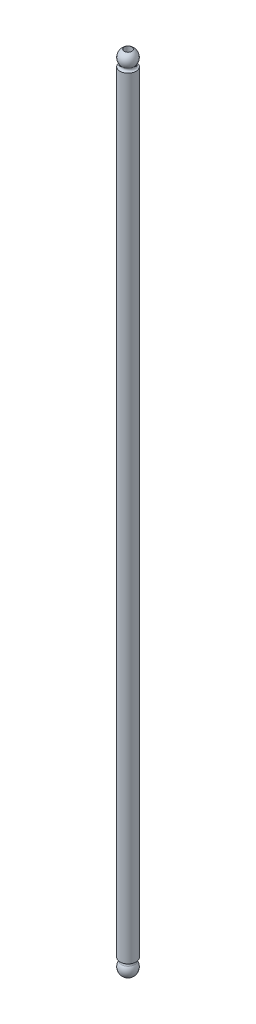
ISO-10303-21;
HEADER;
FILE_DESCRIPTION(('STEP AP214'),'2;1');
FILE_NAME('part.step','',(''),(''),'','','');
FILE_SCHEMA(('AUTOMOTIVE_DESIGN { 1 0 10303 214 1 1 1 1 }'));
ENDSEC;
DATA;
#1=APPLICATION_CONTEXT('core data for automotive mechanical design processes');
#2=APPLICATION_PROTOCOL_DEFINITION('international standard','automotive_design',2000,#1);
#3=PRODUCT_CONTEXT('',#1,'mechanical');
#4=PRODUCT('Part','Part','',(#3));
#5=PRODUCT_RELATED_PRODUCT_CATEGORY('part','',(#4));
#6=PRODUCT_DEFINITION_FORMATION('','',#4);
#7=PRODUCT_DEFINITION_CONTEXT('part definition',#1,'design');
#8=PRODUCT_DEFINITION('design','',#6,#7);
#9=PRODUCT_DEFINITION_SHAPE('','',#8);
#10=(LENGTH_UNIT() NAMED_UNIT(*) SI_UNIT(.MILLI.,.METRE.));
#11=(NAMED_UNIT(*) PLANE_ANGLE_UNIT() SI_UNIT($,.RADIAN.));
#12=(NAMED_UNIT(*) SI_UNIT($,.STERADIAN.) SOLID_ANGLE_UNIT());
#13=UNCERTAINTY_MEASURE_WITH_UNIT(LENGTH_MEASURE(1.E-05),#10,'distance_accuracy_value','');
#14=(GEOMETRIC_REPRESENTATION_CONTEXT(3) GLOBAL_UNCERTAINTY_ASSIGNED_CONTEXT((#13)) GLOBAL_UNIT_ASSIGNED_CONTEXT((#10,
#11,#12)) REPRESENTATION_CONTEXT('',''));
#15=CARTESIAN_POINT('',(0.,0.,0.));
#16=DIRECTION('',(0.,0.,1.));
#17=DIRECTION('',(1.,0.,0.));
#18=AXIS2_PLACEMENT_3D('',#15,#16,#17);
#19=CARTESIAN_POINT('',(0.,152.4,0.));
#20=DIRECTION('',(0.,-1.,0.));
#21=DIRECTION('',(0.,0.,-1.));
#22=AXIS2_PLACEMENT_3D('',#19,#20,#21);
#23=CYLINDRICAL_SURFACE('',#22,3.175);
#24=CARTESIAN_POINT('',(0.,152.4,0.));
#25=DIRECTION('',(0.,1.,0.));
#26=DIRECTION('',(0.,0.,1.));
#27=AXIS2_PLACEMENT_3D('',#24,#25,#26);
#28=CIRCLE('',#27,3.175);
#29=CARTESIAN_POINT('',(0.,152.4,-3.175));
#30=VERTEX_POINT('',#29);
#31=EDGE_CURVE('E10',#30,#30,#28,.T.);
#32=CARTESIAN_POINT('',(0.,-152.4,0.));
#33=DIRECTION('',(0.,1.,0.));
#34=DIRECTION('',(0.,0.,1.));
#35=AXIS2_PLACEMENT_3D('',#32,#33,#34);
#36=CIRCLE('',#35,3.175);
#37=CARTESIAN_POINT('',(0.,-152.4,-3.175));
#38=VERTEX_POINT('',#37);
#39=EDGE_CURVE('E54',#38,#38,#36,.T.);
#40=CARTESIAN_POINT('',(0.,152.4,-3.175));
#41=CARTESIAN_POINT('',(0.,149.225,-3.175));
#42=CARTESIAN_POINT('',(0.,146.05,-3.175));
#43=CARTESIAN_POINT('',(0.,139.7,-3.175));
#44=CARTESIAN_POINT('',(0.,136.525,-3.175));
#45=CARTESIAN_POINT('',(0.,130.175,-3.175));
#46=CARTESIAN_POINT('',(0.,127.,-3.175));
#47=CARTESIAN_POINT('',(0.,120.65,-3.175));
#48=CARTESIAN_POINT('',(0.,117.475,-3.175));
#49=CARTESIAN_POINT('',(0.,111.125,-3.175));
#50=CARTESIAN_POINT('',(0.,107.95,-3.175));
#51=CARTESIAN_POINT('',(0.,101.6,-3.175));
#52=CARTESIAN_POINT('',(0.,98.425,-3.175));
#53=CARTESIAN_POINT('',(0.,92.075,-3.175));
#54=CARTESIAN_POINT('',(0.,88.9,-3.175));
#55=CARTESIAN_POINT('',(0.,82.55,-3.175));
#56=CARTESIAN_POINT('',(0.,79.375,-3.175));
#57=CARTESIAN_POINT('',(0.,73.025,-3.175));
#58=CARTESIAN_POINT('',(0.,69.85,-3.175));
#59=CARTESIAN_POINT('',(0.,63.5,-3.175));
#60=CARTESIAN_POINT('',(0.,60.325,-3.175));
#61=CARTESIAN_POINT('',(0.,53.975,-3.175));
#62=CARTESIAN_POINT('',(0.,50.8,-3.175));
#63=CARTESIAN_POINT('',(0.,44.45,-3.175));
#64=CARTESIAN_POINT('',(0.,41.275,-3.175));
#65=CARTESIAN_POINT('',(0.,34.925,-3.175));
#66=CARTESIAN_POINT('',(0.,31.75,-3.175));
#67=CARTESIAN_POINT('',(0.,25.4,-3.175));
#68=CARTESIAN_POINT('',(0.,22.225,-3.175));
#69=CARTESIAN_POINT('',(0.,15.875,-3.175));
#70=CARTESIAN_POINT('',(0.,12.7,-3.175));
#71=CARTESIAN_POINT('',(0.,6.34999999999998,-3.175));
#72=CARTESIAN_POINT('',(0.,3.17499999999997,-3.175));
#73=CARTESIAN_POINT('',(0.,-3.17500000000003,-3.175));
#74=CARTESIAN_POINT('',(0.,-6.35000000000003,-3.175));
#75=CARTESIAN_POINT('',(0.,-12.7,-3.175));
#76=CARTESIAN_POINT('',(0.,-15.875,-3.175));
#77=CARTESIAN_POINT('',(0.,-22.225,-3.175));
#78=CARTESIAN_POINT('',(0.,-25.4,-3.175));
#79=CARTESIAN_POINT('',(0.,-31.75,-3.175));
#80=CARTESIAN_POINT('',(0.,-34.925,-3.175));
#81=CARTESIAN_POINT('',(0.,-41.275,-3.175));
#82=CARTESIAN_POINT('',(0.,-44.45,-3.175));
#83=CARTESIAN_POINT('',(0.,-50.8,-3.175));
#84=CARTESIAN_POINT('',(0.,-53.975,-3.175));
#85=CARTESIAN_POINT('',(0.,-60.325,-3.175));
#86=CARTESIAN_POINT('',(0.,-63.5,-3.175));
#87=CARTESIAN_POINT('',(0.,-69.85,-3.175));
#88=CARTESIAN_POINT('',(0.,-73.025,-3.175));
#89=CARTESIAN_POINT('',(0.,-79.375,-3.175));
#90=CARTESIAN_POINT('',(0.,-82.5500000000001,-3.175));
#91=CARTESIAN_POINT('',(0.,-88.9,-3.175));
#92=CARTESIAN_POINT('',(0.,-92.0750000000001,-3.175));
#93=CARTESIAN_POINT('',(0.,-98.425,-3.175));
#94=CARTESIAN_POINT('',(0.,-101.6,-3.175));
#95=CARTESIAN_POINT('',(0.,-107.95,-3.175));
#96=CARTESIAN_POINT('',(0.,-111.125,-3.175));
#97=CARTESIAN_POINT('',(0.,-117.475,-3.175));
#98=CARTESIAN_POINT('',(0.,-120.65,-3.175));
#99=CARTESIAN_POINT('',(0.,-127.,-3.175));
#100=CARTESIAN_POINT('',(0.,-130.175,-3.175));
#101=CARTESIAN_POINT('',(0.,-136.525,-3.175));
#102=CARTESIAN_POINT('',(0.,-139.7,-3.175));
#103=CARTESIAN_POINT('',(0.,-146.05,-3.175));
#104=CARTESIAN_POINT('',(0.,-149.225,-3.175));
#105=CARTESIAN_POINT('',(0.,-152.4,-3.175));
#106=B_SPLINE_CURVE_WITH_KNOTS('',3,(#40,#41,#42,#43,#44,#45,#46,#47,#48,#49,#50,#51,#52,#53,
#54,#55,#56,#57,#58,#59,#60,#61,#62,#63,#64,#65,#66,#67,#68,#69,#70,#71,#72,#73,#74,#75,#76,#77,
#78,#79,#80,#81,#82,#83,#84,#85,#86,#87,#88,#89,#90,#91,#92,#93,#94,#95,#96,#97,#98,#99,#100,
#101,#102,#103,#104,#105),.UNSPECIFIED.,.F.,.F.,(4,2,2,2,2,2,2,2,2,2,2,2,2,2,2,2,2,2,2,2,2,2,2,
2,2,2,2,2,2,2,2,2,4),(0.,9.52499999999998,19.05,28.575,38.1,47.625,57.15,66.675,76.2,85.725,
95.25,104.775,114.3,123.825,133.35,142.875,152.4,161.925,171.45,180.975,190.5,200.025,209.55,
219.075,228.6,238.125,247.65,257.175,266.7,276.225,285.75,295.275,304.8),.UNSPECIFIED.);
#107=EDGE_CURVE('BSEAM38',#30,#38,#106,.T.);
#108=ORIENTED_EDGE('',*,*,#31,.F.);
#109=ORIENTED_EDGE('',*,*,#39,.T.);
#110=ORIENTED_EDGE('',*,*,#107,.T.);
#111=ORIENTED_EDGE('',*,*,#107,.F.);
#112=EDGE_LOOP('',(#108,#110,#109,#111));
#113=FACE_BOUND('',#112,.T.);
#114=ADVANCED_FACE('F38',(#113),#23,.T.);
#115=CARTESIAN_POINT('',(0.,153.19375,0.));
#116=DIRECTION('',(0.,1.,0.));
#117=DIRECTION('',(0.,0.,1.));
#118=AXIS2_PLACEMENT_3D('',#115,#116,#117);
#119=TOROIDAL_SURFACE('',#118,3.175,0.793749999999998);
#120=ORIENTED_EDGE('',*,*,#31,.T.);
#121=EDGE_LOOP('',(#120));
#122=FACE_BOUND('',#121,.T.);
#123=CARTESIAN_POINT('',(0.,153.67,0.));
#124=DIRECTION('',(0.,1.,0.));
#125=DIRECTION('',(0.,0.,1.));
#126=AXIS2_PLACEMENT_3D('',#123,#124,#125);
#127=CIRCLE('',#126,2.54);
#128=CARTESIAN_POINT('',(2.53999999999998,153.67,0.));
#129=VERTEX_POINT('',#128);
#130=EDGE_CURVE('E45',#129,#129,#127,.T.);
#131=ORIENTED_EDGE('',*,*,#130,.F.);
#132=EDGE_LOOP('',(#131));
#133=FACE_BOUND('',#132,.T.);
#134=ADVANCED_FACE('F80',(#122,#133),#119,.F.);
#135=CARTESIAN_POINT('',(0.,155.575,0.));
#136=DIRECTION('',(0.,1.,0.));
#137=DIRECTION('',(1.,0.,0.));
#138=AXIS2_PLACEMENT_3D('',#135,#136,#137);
#139=SPHERICAL_SURFACE('',#138,3.17500000000001);
#140=CARTESIAN_POINT('',(0.,158.374075390196,0.));
#141=DIRECTION('',(0.,-1.,0.));
#142=DIRECTION('',(0.,0.,-1.));
#143=AXIS2_PLACEMENT_3D('',#140,#141,#142);
#144=CIRCLE('',#143,1.4986);
#145=CARTESIAN_POINT('',(1.4985999999999,158.374075390196,0.));
#146=VERTEX_POINT('',#145);
#147=EDGE_CURVE('E57',#146,#146,#144,.F.);
#148=CARTESIAN_POINT('',(1.4985999999999,158.374075390196,0.));
#149=CARTESIAN_POINT('',(1.54883079999214,158.347184075902,0.));
#150=CARTESIAN_POINT('',(1.5983360989839,158.318937990729,0.));
#151=CARTESIAN_POINT('',(1.69575588515818,158.259824114946,0.));
#152=CARTESIAN_POINT('',(1.74367037234071,158.228956324335,0.));
#153=CARTESIAN_POINT('',(1.83776872508825,158.164686873996,0.));
#154=CARTESIAN_POINT('',(1.88395259065326,158.131285214267,0.));
#155=CARTESIAN_POINT('',(1.97445614006927,158.062045239578,0.));
#156=CARTESIAN_POINT('',(2.01877582392025,158.026206924618,0.));
#157=CARTESIAN_POINT('',(2.10542252046694,157.952197368329,0.));
#158=CARTESIAN_POINT('',(2.14774953316265,157.914026127001,0.));
#159=CARTESIAN_POINT('',(2.23028826054385,157.835461352804,0.));
#160=CARTESIAN_POINT('',(2.27049997522935,157.795067819935,0.));
#161=CARTESIAN_POINT('',(2.34869158520402,157.712175497579,0.));
#162=CARTESIAN_POINT('',(2.38667148049319,157.669676708092,0.));
#163=CARTESIAN_POINT('',(2.4602894035146,157.582697018045,0.));
#164=CARTESIAN_POINT('',(2.49592743124685,157.538216117487,0.));
#165=CARTESIAN_POINT('',(2.56475835501931,157.447401091345,0.));
#166=CARTESIAN_POINT('',(2.59795125105951,157.401066965762,0.));
#167=CARTESIAN_POINT('',(2.66179573271657,157.306679746226,0.));
#168=CARTESIAN_POINT('',(2.69244731833342,157.258626652273,0.));
#169=CARTESIAN_POINT('',(2.75112036392158,157.160940733286,0.));
#170=CARTESIAN_POINT('',(2.7791418238929,157.111307908251,0.));
#171=CARTESIAN_POINT('',(2.83247342398077,157.010606341829,0.));
#172=CARTESIAN_POINT('',(2.85778356409732,156.959537600441,0.));
#173=CARTESIAN_POINT('',(2.90561918650391,156.856112176698,0.));
#174=CARTESIAN_POINT('',(2.92814466879395,156.803755494342,0.));
#175=CARTESIAN_POINT('',(2.97034570632651,156.697905895955,0.));
#176=CARTESIAN_POINT('',(2.99002126156902,156.644412979923,0.));
#177=CARTESIAN_POINT('',(3.02646543365554,156.536445913794,0.));
#178=CARTESIAN_POINT('',(3.04323405049955,156.481971763696,0.));
#179=CARTESIAN_POINT('',(3.07381575750348,156.372200072244,0.));
#180=CARTESIAN_POINT('',(3.0876288476634,156.316902530888,0.));
#181=CARTESIAN_POINT('',(3.11225947686682,156.205644285564,0.));
#182=CARTESIAN_POINT('',(3.12307701591031,156.149683581595,0.));
#183=CARTESIAN_POINT('',(3.14168519827556,156.037261161248,0.));
#184=CARTESIAN_POINT('',(3.14947584159733,155.98079944487,0.));
#185=CARTESIAN_POINT('',(3.162007658564,155.867538601631,0.));
#186=CARTESIAN_POINT('',(3.16674883220892,155.810739474771,0.));
#187=CARTESIAN_POINT('',(3.17316797192702,155.696968390162,0.));
#188=CARTESIAN_POINT('',(3.1748459380002,155.639996432415,0.));
#189=CARTESIAN_POINT('',(3.17513380054543,155.526044766422,0.));
#190=CARTESIAN_POINT('',(3.17374369701747,155.469065058175,0.));
#191=CARTESIAN_POINT('',(3.16789944828936,155.355262994026,0.));
#192=CARTESIAN_POINT('',(3.16344530308921,155.298440638123,0.));
#193=CARTESIAN_POINT('',(3.15148587721493,155.185117925573,0.));
#194=CARTESIAN_POINT('',(3.1439805965408,155.128617568926,0.));
#195=CARTESIAN_POINT('',(3.1259406468561,155.016102568747,0.));
#196=CARTESIAN_POINT('',(3.11540597784552,154.960087925216,0.));
#197=CARTESIAN_POINT('',(3.09133777630198,154.848706657873,0.));
#198=CARTESIAN_POINT('',(3.07780424376902,154.793340034061,0.));
#199=CARTESIAN_POINT('',(3.04777753015213,154.683415234585,0.));
#200=CARTESIAN_POINT('',(3.0312843490682,154.62885705892,0.));
#201=CARTESIAN_POINT('',(2.99538612638421,154.52070724346,0.));
#202=CARTESIAN_POINT('',(2.97598108478417,154.467115603664,0.));
#203=CARTESIAN_POINT('',(2.93431537663075,154.361054140227,0.));
#204=CARTESIAN_POINT('',(2.91205471007737,154.308584316586,0.));
#205=CARTESIAN_POINT('',(2.86474222389212,154.204918540673,0.));
#206=CARTESIAN_POINT('',(2.83969040426024,154.153722588402,0.));
#207=CARTESIAN_POINT('',(2.78686831343603,154.052752824251,0.));
#208=CARTESIAN_POINT('',(2.75909804224369,154.002979012371,0.));
#209=CARTESIAN_POINT('',(2.70091909649873,153.904998032029,0.));
#210=CARTESIAN_POINT('',(2.6705104219461,153.856790863567,0.));
#211=CARTESIAN_POINT('',(2.6071443414869,153.762081809641,0.));
#212=CARTESIAN_POINT('',(2.57418693558034,153.715579924177,0.));
#213=CARTESIAN_POINT('',(2.53999999999998,153.67,0.));
#214=B_SPLINE_CURVE_WITH_KNOTS('',3,(#148,#149,#150,#151,#152,#153,#154,#155,#156,#157,#158,
#159,#160,#161,#162,#163,#164,#165,#166,#167,#168,#169,#170,#171,#172,#173,#174,#175,#176,#177,
#178,#179,#180,#181,#182,#183,#184,#185,#186,#187,#188,#189,#190,#191,#192,#193,#194,#195,#196,
#197,#198,#199,#200,#201,#202,#203,#204,#205,#206,#207,#208,#209,#210,#211,#212,#213),
.UNSPECIFIED.,.F.,.F.,(4,2,2,2,2,2,2,2,2,2,2,2,2,2,2,2,2,2,2,2,2,2,2,2,2,2,2,2,2,2,2,2,4),(0.,
0.170907411608098,0.341814823216191,0.512722234824289,0.683629646432376,0.854537058040464,
1.02544446964856,1.19635188125665,1.36725929286474,1.53816670447283,1.70907411608093,
1.879981527689,2.0508889392971,2.22179635090518,2.39270376251328,2.56361117412139,
2.73451858572947,2.90542599733757,3.07633340894564,3.24724082055375,3.41814823216183,
3.58905564376993,3.75996305537801,3.93087046698611,4.10177787859421,4.27268529020228,
4.44359270181039,4.61450011341847,4.78540752502656,4.95631493663464,5.12722234824274,
5.29812975985083,5.46903717145894),.UNSPECIFIED.);
#215=EDGE_CURVE('BSEAM74',#146,#129,#214,.T.);
#216=ORIENTED_EDGE('',*,*,#147,.F.);
#217=ORIENTED_EDGE('',*,*,#130,.T.);
#218=ORIENTED_EDGE('',*,*,#215,.T.);
#219=ORIENTED_EDGE('',*,*,#215,.F.);
#220=EDGE_LOOP('',(#216,#218,#217,#219));
#221=FACE_BOUND('',#220,.T.);
#222=ADVANCED_FACE('F74',(#221),#139,.T.);
#223=CARTESIAN_POINT('',(0.,-153.19375,0.));
#224=DIRECTION('',(0.,-1.,0.));
#225=DIRECTION('',(0.,0.,1.));
#226=AXIS2_PLACEMENT_3D('',#223,#224,#225);
#227=TOROIDAL_SURFACE('',#226,3.175,0.793749999999998);
#228=ORIENTED_EDGE('',*,*,#39,.F.);
#229=EDGE_LOOP('',(#228));
#230=FACE_BOUND('',#229,.T.);
#231=CARTESIAN_POINT('',(0.,-153.67,0.));
#232=DIRECTION('',(0.,1.,0.));
#233=DIRECTION('',(0.,0.,1.));
#234=AXIS2_PLACEMENT_3D('',#231,#232,#233);
#235=CIRCLE('',#234,2.54);
#236=CARTESIAN_POINT('',(2.54000000000001,-153.67,0.));
#237=VERTEX_POINT('',#236);
#238=EDGE_CURVE('E49',#237,#237,#235,.T.);
#239=ORIENTED_EDGE('',*,*,#238,.T.);
#240=EDGE_LOOP('',(#239));
#241=FACE_BOUND('',#240,.T.);
#242=ADVANCED_FACE('F69',(#230,#241),#227,.F.);
#243=CARTESIAN_POINT('',(0.,-155.575,0.));
#244=DIRECTION('',(0.,-1.,0.));
#245=DIRECTION('',(1.,0.,0.));
#246=AXIS2_PLACEMENT_3D('',#243,#244,#245);
#247=SPHERICAL_SURFACE('',#246,3.17500000000001);
#248=CARTESIAN_POINT('',(0.,-158.374075390196,0.));
#249=DIRECTION('',(0.,1.,0.));
#250=DIRECTION('',(0.,0.,1.));
#251=AXIS2_PLACEMENT_3D('',#248,#249,#250);
#252=CIRCLE('',#251,1.4986);
#253=CARTESIAN_POINT('',(1.49859999999995,-158.374075390196,0.));
#254=VERTEX_POINT('',#253);
#255=EDGE_CURVE('E41',#254,#254,#252,.F.);
#256=CARTESIAN_POINT('',(1.49859999999995,-158.374075390196,0.));
#257=CARTESIAN_POINT('',(1.54883079999219,-158.347184075902,0.));
#258=CARTESIAN_POINT('',(1.59833609898395,-158.318937990729,0.));
#259=CARTESIAN_POINT('',(1.69575588515823,-158.259824114946,0.));
#260=CARTESIAN_POINT('',(1.74367037234075,-158.228956324335,0.));
#261=CARTESIAN_POINT('',(1.83776872508829,-158.164686873996,0.));
#262=CARTESIAN_POINT('',(1.8839525906533,-158.131285214267,0.));
#263=CARTESIAN_POINT('',(1.9744561400693,-158.062045239578,0.));
#264=CARTESIAN_POINT('',(2.01877582392029,-158.026206924618,0.));
#265=CARTESIAN_POINT('',(2.10542252046698,-157.952197368329,0.));
#266=CARTESIAN_POINT('',(2.14774953316268,-157.914026127001,0.));
#267=CARTESIAN_POINT('',(2.23028826054388,-157.835461352804,0.));
#268=CARTESIAN_POINT('',(2.27049997522938,-157.795067819935,0.));
#269=CARTESIAN_POINT('',(2.34869158520405,-157.712175497579,0.));
#270=CARTESIAN_POINT('',(2.38667148049321,-157.669676708092,0.));
#271=CARTESIAN_POINT('',(2.46028940351463,-157.582697018045,0.));
#272=CARTESIAN_POINT('',(2.49592743124688,-157.538216117487,0.));
#273=CARTESIAN_POINT('',(2.56475835501933,-157.447401091345,0.));
#274=CARTESIAN_POINT('',(2.59795125105953,-157.401066965762,0.));
#275=CARTESIAN_POINT('',(2.66179573271658,-157.306679746226,0.));
#276=CARTESIAN_POINT('',(2.69244731833343,-157.258626652273,0.));
#277=CARTESIAN_POINT('',(2.7511203639216,-157.160940733286,0.));
#278=CARTESIAN_POINT('',(2.77914182389291,-157.111307908251,0.));
#279=CARTESIAN_POINT('',(2.83247342398078,-157.010606341829,0.));
#280=CARTESIAN_POINT('',(2.85778356409733,-156.959537600441,0.));
#281=CARTESIAN_POINT('',(2.90561918650392,-156.856112176698,0.));
#282=CARTESIAN_POINT('',(2.92814466879396,-156.803755494342,0.));
#283=CARTESIAN_POINT('',(2.97034570632651,-156.697905895954,0.));
#284=CARTESIAN_POINT('',(2.99002126156902,-156.644412979923,0.));
#285=CARTESIAN_POINT('',(3.02646543365554,-156.536445913794,0.));
#286=CARTESIAN_POINT('',(3.04323405049955,-156.481971763696,0.));
#287=CARTESIAN_POINT('',(3.07381575750348,-156.372200072244,0.));
#288=CARTESIAN_POINT('',(3.0876288476634,-156.316902530888,0.));
#289=CARTESIAN_POINT('',(3.11225947686682,-156.205644285564,0.));
#290=CARTESIAN_POINT('',(3.12307701591031,-156.149683581595,0.));
#291=CARTESIAN_POINT('',(3.14168519827557,-156.037261161248,0.));
#292=CARTESIAN_POINT('',(3.14947584159733,-155.98079944487,0.));
#293=CARTESIAN_POINT('',(3.162007658564,-155.867538601631,0.));
#294=CARTESIAN_POINT('',(3.16674883220892,-155.810739474771,0.));
#295=CARTESIAN_POINT('',(3.17316797192702,-155.696968390162,0.));
#296=CARTESIAN_POINT('',(3.1748459380002,-155.639996432415,0.));
#297=CARTESIAN_POINT('',(3.17513380054543,-155.526044766422,0.));
#298=CARTESIAN_POINT('',(3.17374369701747,-155.469065058175,0.));
#299=CARTESIAN_POINT('',(3.16789944828936,-155.355262994026,0.));
#300=CARTESIAN_POINT('',(3.16344530308921,-155.298440638123,0.));
#301=CARTESIAN_POINT('',(3.15148587721493,-155.185117925573,0.));
#302=CARTESIAN_POINT('',(3.14398059654081,-155.128617568926,0.));
#303=CARTESIAN_POINT('',(3.1259406468561,-155.016102568747,0.));
#304=CARTESIAN_POINT('',(3.11540597784552,-154.960087925216,0.));
#305=CARTESIAN_POINT('',(3.09133777630198,-154.848706657873,0.));
#306=CARTESIAN_POINT('',(3.07780424376903,-154.793340034061,0.));
#307=CARTESIAN_POINT('',(3.04777753015214,-154.683415234585,0.));
#308=CARTESIAN_POINT('',(3.0312843490682,-154.628857058921,0.));
#309=CARTESIAN_POINT('',(2.99538612638422,-154.52070724346,0.));
#310=CARTESIAN_POINT('',(2.97598108478418,-154.467115603664,0.));
#311=CARTESIAN_POINT('',(2.93431537663076,-154.361054140227,0.));
#312=CARTESIAN_POINT('',(2.91205471007737,-154.308584316586,0.));
#313=CARTESIAN_POINT('',(2.86474222389212,-154.204918540674,0.));
#314=CARTESIAN_POINT('',(2.83969040426025,-154.153722588402,0.));
#315=CARTESIAN_POINT('',(2.78686831343604,-154.052752824251,0.));
#316=CARTESIAN_POINT('',(2.75909804224371,-154.002979012371,0.));
#317=CARTESIAN_POINT('',(2.70091909649874,-153.904998032029,0.));
#318=CARTESIAN_POINT('',(2.67051042194612,-153.856790863567,0.));
#319=CARTESIAN_POINT('',(2.60714434148693,-153.762081809641,0.));
#320=CARTESIAN_POINT('',(2.57418693558036,-153.715579924177,0.));
#321=CARTESIAN_POINT('',(2.54000000000001,-153.67,0.));
#322=B_SPLINE_CURVE_WITH_KNOTS('',3,(#256,#257,#258,#259,#260,#261,#262,#263,#264,#265,#266,
#267,#268,#269,#270,#271,#272,#273,#274,#275,#276,#277,#278,#279,#280,#281,#282,#283,#284,#285,
#286,#287,#288,#289,#290,#291,#292,#293,#294,#295,#296,#297,#298,#299,#300,#301,#302,#303,#304,
#305,#306,#307,#308,#309,#310,#311,#312,#313,#314,#315,#316,#317,#318,#319,#320,#321),
.UNSPECIFIED.,.F.,.F.,(4,2,2,2,2,2,2,2,2,2,2,2,2,2,2,2,2,2,2,2,2,2,2,2,2,2,2,2,2,2,2,2,4),(0.,
0.170907411608095,0.341814823216184,0.512722234824279,0.683629646432363,0.854537058040448,
1.02544446964854,1.19635188125663,1.36725929286472,1.5381667044728,1.7090741160809,
1.87998152768898,2.05088893929707,2.22179635090515,2.39270376251326,2.56361117412133,
2.73451858572942,2.90542599733751,3.07633340894561,3.24724082055369,3.41814823216177,
3.58905564376988,3.75996305537795,3.93087046698605,4.10177787859412,4.27268529020222,
4.4435927018103,4.61450011341841,4.78540752502647,4.95631493663458,5.12722234824266,
5.29812975985074,5.46903717145883),.UNSPECIFIED.);
#323=EDGE_CURVE('BSEAM66',#254,#237,#322,.T.);
#324=ORIENTED_EDGE('',*,*,#255,.F.);
#325=ORIENTED_EDGE('',*,*,#238,.F.);
#326=ORIENTED_EDGE('',*,*,#323,.T.);
#327=ORIENTED_EDGE('',*,*,#323,.F.);
#328=EDGE_LOOP('',(#324,#326,#325,#327));
#329=FACE_BOUND('',#328,.T.);
#330=ADVANCED_FACE('F66',(#329),#247,.T.);
#331=CARTESIAN_POINT('',(0.,-158.75,0.));
#332=DIRECTION('',(0.,1.,0.));
#333=DIRECTION('',(0.,0.,1.));
#334=AXIS2_PLACEMENT_3D('',#331,#332,#333);
#335=CYLINDRICAL_SURFACE('',#334,1.4986);
#336=ORIENTED_EDGE('',*,*,#147,.T.);
#337=EDGE_LOOP('',(#336));
#338=FACE_BOUND('',#337,.T.);
#339=ORIENTED_EDGE('',*,*,#255,.T.);
#340=EDGE_LOOP('',(#339));
#341=FACE_BOUND('',#340,.T.);
#342=ADVANCED_FACE('F64',(#338,#341),#335,.F.);
#343=CLOSED_SHELL('',(#114,#134,#222,#242,#330,#342));
#344=MANIFOLD_SOLID_BREP('B2',#343);
#345=ADVANCED_BREP_SHAPE_REPRESENTATION('',(#18,#344),#14);
#346=SHAPE_DEFINITION_REPRESENTATION(#9,#345);
ENDSEC;
END-ISO-10303-21;
